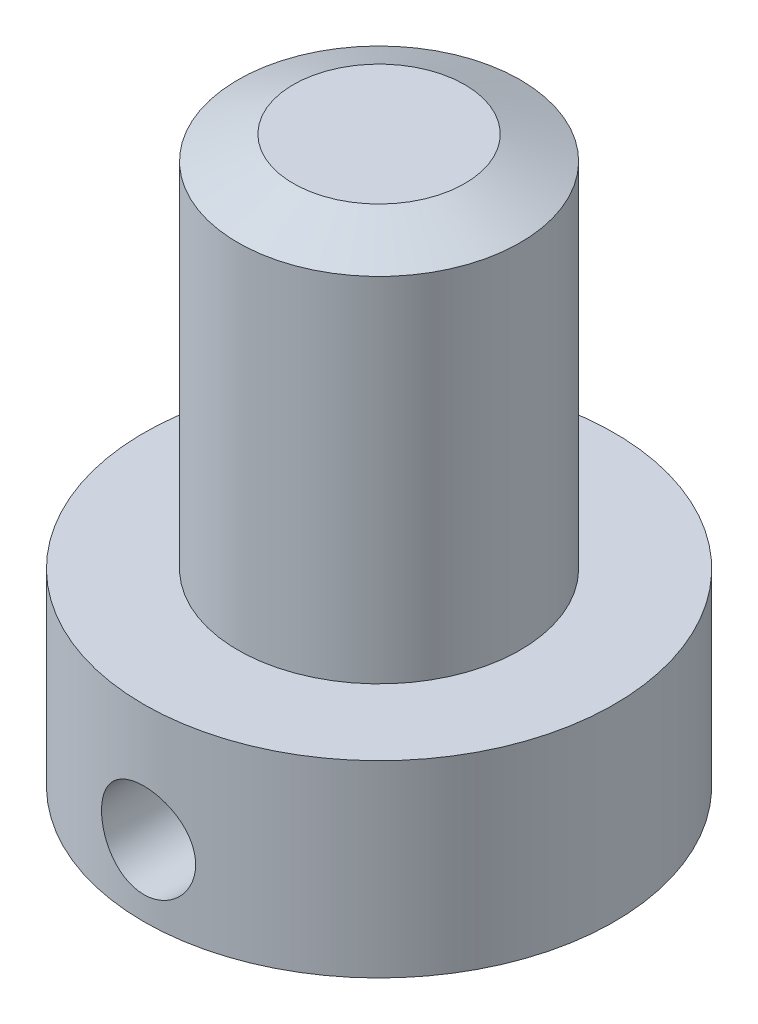
ISO-10303-21;
HEADER;
FILE_DESCRIPTION(('STEP AP214'),'2;1');
FILE_NAME('part.step','',(''),(''),'','','');
FILE_SCHEMA(('AUTOMOTIVE_DESIGN { 1 0 10303 214 1 1 1 1 }'));
ENDSEC;
DATA;
#1=APPLICATION_CONTEXT('core data for automotive mechanical design processes');
#2=APPLICATION_PROTOCOL_DEFINITION('international standard','automotive_design',2000,#1);
#3=PRODUCT_CONTEXT('',#1,'mechanical');
#4=PRODUCT('Part','Part','',(#3));
#5=PRODUCT_RELATED_PRODUCT_CATEGORY('part','',(#4));
#6=PRODUCT_DEFINITION_FORMATION('','',#4);
#7=PRODUCT_DEFINITION_CONTEXT('part definition',#1,'design');
#8=PRODUCT_DEFINITION('design','',#6,#7);
#9=PRODUCT_DEFINITION_SHAPE('','',#8);
#10=(LENGTH_UNIT() NAMED_UNIT(*) SI_UNIT(.MILLI.,.METRE.));
#11=(NAMED_UNIT(*) PLANE_ANGLE_UNIT() SI_UNIT($,.RADIAN.));
#12=(NAMED_UNIT(*) SI_UNIT($,.STERADIAN.) SOLID_ANGLE_UNIT());
#13=UNCERTAINTY_MEASURE_WITH_UNIT(LENGTH_MEASURE(1.E-05),#10,'distance_accuracy_value','');
#14=(GEOMETRIC_REPRESENTATION_CONTEXT(3) GLOBAL_UNCERTAINTY_ASSIGNED_CONTEXT((#13)) GLOBAL_UNIT_ASSIGNED_CONTEXT((#10,
#11,#12)) REPRESENTATION_CONTEXT('',''));
#15=CARTESIAN_POINT('',(0.,0.,0.));
#16=DIRECTION('',(0.,0.,1.));
#17=DIRECTION('',(1.,0.,0.));
#18=AXIS2_PLACEMENT_3D('',#15,#16,#17);
#19=CARTESIAN_POINT('',(0.,-5.,0.));
#20=DIRECTION('',(0.,-1.,0.));
#21=DIRECTION('',(0.,0.,-1.));
#22=AXIS2_PLACEMENT_3D('',#19,#20,#21);
#23=PLANE('',#22);
#24=CARTESIAN_POINT('',(0.,-4.99999999993861,0.));
#25=DIRECTION('',(0.,1.,0.));
#26=DIRECTION('',(0.,0.,1.));
#27=AXIS2_PLACEMENT_3D('',#24,#25,#26);
#28=CIRCLE('',#27,2.64414763421428);
#29=CARTESIAN_POINT('',(0.,-4.99999999993861,2.64414763421428));
#30=VERTEX_POINT('',#29);
#31=EDGE_CURVE('E18',#30,#30,#28,.T.);
#32=ORIENTED_EDGE('',*,*,#31,.F.);
#33=EDGE_LOOP('',(#32));
#34=FACE_BOUND('',#33,.T.);
#35=ADVANCED_FACE('F15',(#34),#23,.T.);
#36=CARTESIAN_POINT('',(0.,-3.99999999999068,0.));
#37=DIRECTION('',(0.,1.,0.));
#38=DIRECTION('',(0.,0.,1.));
#39=AXIS2_PLACEMENT_3D('',#36,#37,#38);
#40=CONICAL_SURFACE('',#39,4.99999999993861,1.16937059883975);
#41=ORIENTED_EDGE('',*,*,#31,.T.);
#42=EDGE_LOOP('',(#41));
#43=FACE_BOUND('',#42,.T.);
#44=CARTESIAN_POINT('',(0.,-4.,0.));
#45=DIRECTION('',(0.,1.,0.));
#46=DIRECTION('',(0.,0.,1.));
#47=AXIS2_PLACEMENT_3D('',#44,#45,#46);
#48=CIRCLE('',#47,5.);
#49=CARTESIAN_POINT('',(0.,-4.,5.));
#50=VERTEX_POINT('',#49);
#51=EDGE_CURVE('E31',#50,#50,#48,.T.);
#52=ORIENTED_EDGE('',*,*,#51,.F.);
#53=EDGE_LOOP('',(#52));
#54=FACE_BOUND('',#53,.T.);
#55=ADVANCED_FACE('F64',(#43,#54),#40,.T.);
#56=CARTESIAN_POINT('',(0.,-2.5,-5.));
#57=DIRECTION('',(0.,0.,1.));
#58=DIRECTION('',(1.,0.,0.));
#59=AXIS2_PLACEMENT_3D('',#56,#57,#58);
#60=CYLINDRICAL_SURFACE('',#59,1.);
#61=CARTESIAN_POINT('',(0.,-3.5,5.));
#62=CARTESIAN_POINT('',(-0.0555660899557541,-3.49999758833867,4.99999879921278));
#63=CARTESIAN_POINT('',(-0.111165860292172,-3.49535211977595,4.99906401975124));
#64=CARTESIAN_POINT('',(-0.220802499525631,-3.47690471390568,4.99542431257793));
#65=CARTESIAN_POINT('',(-0.274837715618948,-3.46309343747751,4.99271757944547));
#66=CARTESIAN_POINT('',(-0.379732039429442,-3.42675799601684,4.98583634570209));
#67=CARTESIAN_POINT('',(-0.430594361145944,-3.40424281972277,4.98166335973136));
#68=CARTESIAN_POINT('',(-0.527811709985339,-3.35116533868859,4.97230357823047));
#69=CARTESIAN_POINT('',(-0.574167356309711,-3.3206041415893,4.96711692227064));
#70=CARTESIAN_POINT('',(-0.661688712483616,-3.25186532414265,4.95622223968352));
#71=CARTESIAN_POINT('',(-0.702785065204754,-3.21360026809398,4.95050867816156));
#72=CARTESIAN_POINT('',(-0.778029451315118,-3.13071679561595,4.9392430057825));
#73=CARTESIAN_POINT('',(-0.812175448515783,-3.08609652383999,4.93369094264538));
#74=CARTESIAN_POINT('',(-0.872847544067748,-2.99126034012851,4.92332167047395));
#75=CARTESIAN_POINT('',(-0.899298039084476,-2.94099522045782,4.9185119571059));
#76=CARTESIAN_POINT('',(-0.943324794525737,-2.83665579767931,4.9102591314283));
#77=CARTESIAN_POINT('',(-0.96091117411527,-2.78258591879904,4.90681446176687));
#78=CARTESIAN_POINT('',(-0.982492106962822,-2.69019342934517,4.90252831695839));
#79=CARTESIAN_POINT('',(-0.989047250453888,-2.65247137159105,4.90120451071183));
#80=CARTESIAN_POINT('',(-0.997801984660447,-2.57650486501253,4.89942965863018));
#81=CARTESIAN_POINT('',(-1.00000166828393,-2.53826042734874,4.89897859417831));
#82=CARTESIAN_POINT('',(-0.999997577676552,-2.44444642873404,4.89898077984854));
#83=CARTESIAN_POINT('',(-0.995354131432741,-2.38885914704218,4.89993491490869));
#84=CARTESIAN_POINT('',(-0.976915489593405,-2.2792484727456,4.90364364451088));
#85=CARTESIAN_POINT('',(-0.963110911908651,-2.22522674270769,4.90640008478535));
#86=CARTESIAN_POINT('',(-0.926795053169297,-2.12036096499901,4.91338888688327));
#87=CARTESIAN_POINT('',(-0.904293073174589,-2.06951358989501,4.91761967155898));
#88=CARTESIAN_POINT('',(-0.851246697438147,-1.97232143808981,4.9270783997548));
#89=CARTESIAN_POINT('',(-0.820703378022719,-1.92597605993588,4.93230620979813));
#90=CARTESIAN_POINT('',(-0.751982893703484,-1.83844376275209,4.94325240741494));
#91=CARTESIAN_POINT('',(-0.713714278944508,-1.7973293017679,4.94897615217622));
#92=CARTESIAN_POINT('',(-0.630816004266841,-1.72204977523525,4.9602235287064));
#93=CARTESIAN_POINT('',(-0.586184537489432,-1.68788669038032,4.96574710307222));
#94=CARTESIAN_POINT('',(-0.491337927342742,-1.62719621588172,4.97603068021787));
#95=CARTESIAN_POINT('',(-0.44107550305954,-1.60074142646883,4.98078324712073));
#96=CARTESIAN_POINT('',(-0.336741881764226,-1.55670596135512,4.9889208679889));
#97=CARTESIAN_POINT('',(-0.282675081444655,-1.53911522742518,4.99230747106678));
#98=CARTESIAN_POINT('',(-0.190271085007254,-1.51752226955323,4.99651814387714));
#99=CARTESIAN_POINT('',(-0.15253343331506,-1.51096170573971,4.99781734299069));
#100=CARTESIAN_POINT('',(-0.0765358412171107,-1.50219978359349,4.99955867612138));
#101=CARTESIAN_POINT('',(-0.0382759111902653,-1.49999833876137,5.00000082714521));
#102=CARTESIAN_POINT('',(0.055566089955753,-1.50000241166133,4.99999879921278));
#103=CARTESIAN_POINT('',(0.111165860292171,-1.50464788022405,4.99906401975124));
#104=CARTESIAN_POINT('',(0.22080249952563,-1.52309528609432,4.99542431257793));
#105=CARTESIAN_POINT('',(0.274837715618947,-1.53690656252249,4.99271757944547));
#106=CARTESIAN_POINT('',(0.379732039429441,-1.57324200398316,4.98583634570209));
#107=CARTESIAN_POINT('',(0.430594361145943,-1.59575718027723,4.98166335973136));
#108=CARTESIAN_POINT('',(0.527811709985337,-1.64883466131141,4.97230357823047));
#109=CARTESIAN_POINT('',(0.57416735630971,-1.6793958584107,4.96711692227064));
#110=CARTESIAN_POINT('',(0.661688712483615,-1.74813467585735,4.95622223968352));
#111=CARTESIAN_POINT('',(0.702785065204753,-1.78639973190602,4.95050867816156));
#112=CARTESIAN_POINT('',(0.778029451315117,-1.86928320438405,4.9392430057825));
#113=CARTESIAN_POINT('',(0.812175448515782,-1.91390347616001,4.93369094264538));
#114=CARTESIAN_POINT('',(0.872847544067747,-2.00873965987149,4.92332167047395));
#115=CARTESIAN_POINT('',(0.899298039084475,-2.05900477954218,4.9185119571059));
#116=CARTESIAN_POINT('',(0.943324794525736,-2.16334420232068,4.9102591314283));
#117=CARTESIAN_POINT('',(0.960911174115269,-2.21741408120096,4.90681446176687));
#118=CARTESIAN_POINT('',(0.982492106962821,-2.30980657065483,4.90252831695839));
#119=CARTESIAN_POINT('',(0.989047250453888,-2.34752862840895,4.90120451071183));
#120=CARTESIAN_POINT('',(0.997801984660447,-2.42349513498747,4.89942965863018));
#121=CARTESIAN_POINT('',(1.00000166828393,-2.46173957265126,4.89897859417831));
#122=CARTESIAN_POINT('',(0.999997577676552,-2.55555357126597,4.89898077984854));
#123=CARTESIAN_POINT('',(0.995354131432741,-2.61114085295782,4.89993491490869));
#124=CARTESIAN_POINT('',(0.976915489593405,-2.72075152725441,4.90364364451088));
#125=CARTESIAN_POINT('',(0.963110911908651,-2.77477325729231,4.90640008478535));
#126=CARTESIAN_POINT('',(0.926795053169297,-2.87963903500099,4.91338888688327));
#127=CARTESIAN_POINT('',(0.904293073174589,-2.93048641010499,4.91761967155898));
#128=CARTESIAN_POINT('',(0.851246697438147,-3.02767856191019,4.9270783997548));
#129=CARTESIAN_POINT('',(0.820703378022719,-3.07402394006412,4.93230620979813));
#130=CARTESIAN_POINT('',(0.751982893703484,-3.16155623724791,4.94325240741494));
#131=CARTESIAN_POINT('',(0.713714278944508,-3.2026706982321,4.94897615217622));
#132=CARTESIAN_POINT('',(0.630816004266841,-3.27795022476475,4.9602235287064));
#133=CARTESIAN_POINT('',(0.586184537489432,-3.31211330961968,4.96574710307222));
#134=CARTESIAN_POINT('',(0.491337927342741,-3.37280378411828,4.97603068021787));
#135=CARTESIAN_POINT('',(0.44107550305954,-3.39925857353117,4.98078324712073));
#136=CARTESIAN_POINT('',(0.336741881764227,-3.44329403864488,4.9889208679889));
#137=CARTESIAN_POINT('',(0.282675081444655,-3.46088477257482,4.99230747106678));
#138=CARTESIAN_POINT('',(0.190271085007254,-3.48247773044677,4.99651814387714));
#139=CARTESIAN_POINT('',(0.15253343331506,-3.48903829426029,4.99781734299069));
#140=CARTESIAN_POINT('',(0.0765358412171101,-3.49780021640651,4.99955867612138));
#141=CARTESIAN_POINT('',(0.0382759111902644,-3.50000166123863,5.00000082714521));
#142=CARTESIAN_POINT('',(0.,-3.5,5.));
#143=B_SPLINE_CURVE_WITH_KNOTS('',3,(#61,#62,#63,#64,#65,#66,#67,#68,#69,#70,#71,#72,#73,#74,
#75,#76,#77,#78,#79,#80,#81,#82,#83,#84,#85,#86,#87,#88,#89,#90,#91,#92,#93,#94,#95,#96,#97,#98,
#99,#100,#101,#102,#103,#104,#105,#106,#107,#108,#109,#110,#111,#112,#113,#114,#115,#116,#117,
#118,#119,#120,#121,#122,#123,#124,#125,#126,#127,#128,#129,#130,#131,#132,#133,#134,#135,#136,
#137,#138,#139,#140,#141,#142),.UNSPECIFIED.,.T.,.F.,(4,2,2,2,2,2,2,2,2,2,2,2,2,2,2,2,2,2,2,2,2,
2,2,2,2,2,2,2,2,2,2,2,2,2,2,2,2,2,2,2,4),(0.,0.166557341649282,0.333284651099258,
0.499840235029466,0.666372902365899,0.834914596822325,1.00350559671287,1.17370091491384,
1.34370149766706,1.45838812199119,1.57307229986442,1.73959201984785,1.90628253956532,
2.07279529034781,2.23928576486402,2.40787674726783,2.57651570015802,2.74669511488504,
2.91668098615488,3.0314139200321,3.14614457720325,3.31270191885253,3.47942922830251,
3.64598481223271,3.81251747956914,3.98105917402557,4.14965017391612,4.31984549211708,
4.4898460748703,4.60453269919444,4.71921687706766,4.8857365970511,5.05242711676856,
5.21893986755105,5.38543034206726,5.55402132447108,5.72266027736126,5.89283969208829,
6.06282556335812,6.17755849723535,6.2922891544065),.UNSPECIFIED.);
#144=CARTESIAN_POINT('',(0.,-3.5,5.));
#145=VERTEX_POINT('',#144);
#146=EDGE_CURVE('E43',#145,#145,#143,.T.);
#147=ORIENTED_EDGE('',*,*,#146,.F.);
#148=EDGE_LOOP('',(#147));
#149=FACE_BOUND('',#148,.T.);
#150=CARTESIAN_POINT('',(1.,-2.5,-4.89897948556636));
#151=CARTESIAN_POINT('',(0.999997577676552,-2.44444642873404,-4.89898077984854));
#152=CARTESIAN_POINT('',(0.995354131432741,-2.38885914704218,-4.89993491490869));
#153=CARTESIAN_POINT('',(0.976915489593405,-2.27924847274559,-4.90364364451088));
#154=CARTESIAN_POINT('',(0.963110911908651,-2.22522674270769,-4.90640008478535));
#155=CARTESIAN_POINT('',(0.926795053169297,-2.12036096499901,-4.91338888688327));
#156=CARTESIAN_POINT('',(0.904293073174589,-2.06951358989501,-4.91761967155898));
#157=CARTESIAN_POINT('',(0.851246697438147,-1.97232143808981,-4.9270783997548));
#158=CARTESIAN_POINT('',(0.820703378022719,-1.92597605993588,-4.93230620979813));
#159=CARTESIAN_POINT('',(0.751982893703484,-1.83844376275209,-4.94325240741494));
#160=CARTESIAN_POINT('',(0.713714278944508,-1.7973293017679,-4.94897615217622));
#161=CARTESIAN_POINT('',(0.630816004266841,-1.72204977523525,-4.9602235287064));
#162=CARTESIAN_POINT('',(0.586184537489432,-1.68788669038032,-4.96574710307222));
#163=CARTESIAN_POINT('',(0.491337927342742,-1.62719621588172,-4.97603068021787));
#164=CARTESIAN_POINT('',(0.44107550305954,-1.60074142646883,-4.98078324712073));
#165=CARTESIAN_POINT('',(0.336741881764227,-1.55670596135512,-4.9889208679889));
#166=CARTESIAN_POINT('',(0.282675081444655,-1.53911522742518,-4.99230747106678));
#167=CARTESIAN_POINT('',(0.190271085007254,-1.51752226955323,-4.99651814387714));
#168=CARTESIAN_POINT('',(0.15253343331506,-1.51096170573971,-4.99781734299069));
#169=CARTESIAN_POINT('',(0.0765358412171108,-1.50219978359349,-4.99955867612138));
#170=CARTESIAN_POINT('',(0.0382759111902652,-1.49999833876137,-5.00000082714521));
#171=CARTESIAN_POINT('',(-0.0555660899557532,-1.50000241166133,-4.99999879921278));
#172=CARTESIAN_POINT('',(-0.111165860292171,-1.50464788022405,-4.99906401975124));
#173=CARTESIAN_POINT('',(-0.22080249952563,-1.52309528609432,-4.99542431257793));
#174=CARTESIAN_POINT('',(-0.274837715618947,-1.53690656252249,-4.99271757944547));
#175=CARTESIAN_POINT('',(-0.379732039429441,-1.57324200398316,-4.98583634570209));
#176=CARTESIAN_POINT('',(-0.430594361145943,-1.59575718027723,-4.98166335973136));
#177=CARTESIAN_POINT('',(-0.527811709985337,-1.64883466131141,-4.97230357823047));
#178=CARTESIAN_POINT('',(-0.57416735630971,-1.6793958584107,-4.96711692227064));
#179=CARTESIAN_POINT('',(-0.661688712483615,-1.74813467585735,-4.95622223968352));
#180=CARTESIAN_POINT('',(-0.702785065204753,-1.78639973190602,-4.95050867816156));
#181=CARTESIAN_POINT('',(-0.778029451315117,-1.86928320438405,-4.9392430057825));
#182=CARTESIAN_POINT('',(-0.812175448515782,-1.91390347616001,-4.93369094264538));
#183=CARTESIAN_POINT('',(-0.872847544067747,-2.00873965987149,-4.92332167047395));
#184=CARTESIAN_POINT('',(-0.899298039084475,-2.05900477954218,-4.9185119571059));
#185=CARTESIAN_POINT('',(-0.943324794525737,-2.16334420232068,-4.9102591314283));
#186=CARTESIAN_POINT('',(-0.96091117411527,-2.21741408120096,-4.90681446176687));
#187=CARTESIAN_POINT('',(-0.982492106962821,-2.30980657065483,-4.90252831695839));
#188=CARTESIAN_POINT('',(-0.989047250453888,-2.34752862840895,-4.90120451071183));
#189=CARTESIAN_POINT('',(-0.997801984660447,-2.42349513498747,-4.89942965863018));
#190=CARTESIAN_POINT('',(-1.00000166828393,-2.46173957265126,-4.89897859417831));
#191=CARTESIAN_POINT('',(-0.999997577676552,-2.55555357126597,-4.89898077984854));
#192=CARTESIAN_POINT('',(-0.995354131432741,-2.61114085295782,-4.89993491490869));
#193=CARTESIAN_POINT('',(-0.976915489593405,-2.72075152725441,-4.90364364451088));
#194=CARTESIAN_POINT('',(-0.963110911908651,-2.77477325729231,-4.90640008478535));
#195=CARTESIAN_POINT('',(-0.926795053169297,-2.87963903500099,-4.91338888688327));
#196=CARTESIAN_POINT('',(-0.904293073174589,-2.93048641010499,-4.91761967155898));
#197=CARTESIAN_POINT('',(-0.851246697438147,-3.02767856191019,-4.9270783997548));
#198=CARTESIAN_POINT('',(-0.820703378022719,-3.07402394006412,-4.93230620979813));
#199=CARTESIAN_POINT('',(-0.751982893703484,-3.16155623724791,-4.94325240741494));
#200=CARTESIAN_POINT('',(-0.713714278944509,-3.2026706982321,-4.94897615217622));
#201=CARTESIAN_POINT('',(-0.630816004266841,-3.27795022476475,-4.9602235287064));
#202=CARTESIAN_POINT('',(-0.586184537489432,-3.31211330961968,-4.96574710307222));
#203=CARTESIAN_POINT('',(-0.491337927342742,-3.37280378411828,-4.97603068021787));
#204=CARTESIAN_POINT('',(-0.44107550305954,-3.39925857353117,-4.98078324712073));
#205=CARTESIAN_POINT('',(-0.336741881764227,-3.44329403864488,-4.9889208679889));
#206=CARTESIAN_POINT('',(-0.282675081444655,-3.46088477257482,-4.99230747106678));
#207=CARTESIAN_POINT('',(-0.190271085007254,-3.48247773044677,-4.99651814387714));
#208=CARTESIAN_POINT('',(-0.15253343331506,-3.48903829426029,-4.99781734299069));
#209=CARTESIAN_POINT('',(-0.0765358412171103,-3.49780021640651,-4.99955867612138));
#210=CARTESIAN_POINT('',(-0.0382759111902646,-3.50000166123863,-5.00000082714521));
#211=CARTESIAN_POINT('',(0.0555660899557539,-3.49999758833867,-4.99999879921278));
#212=CARTESIAN_POINT('',(0.111165860292172,-3.49535211977595,-4.99906401975124));
#213=CARTESIAN_POINT('',(0.22080249952563,-3.47690471390568,-4.99542431257793));
#214=CARTESIAN_POINT('',(0.274837715618948,-3.46309343747751,-4.99271757944547));
#215=CARTESIAN_POINT('',(0.379732039429441,-3.42675799601684,-4.98583634570209));
#216=CARTESIAN_POINT('',(0.430594361145944,-3.40424281972277,-4.98166335973136));
#217=CARTESIAN_POINT('',(0.527811709985338,-3.35116533868859,-4.97230357823047));
#218=CARTESIAN_POINT('',(0.574167356309711,-3.3206041415893,-4.96711692227064));
#219=CARTESIAN_POINT('',(0.661688712483616,-3.25186532414265,-4.95622223968352));
#220=CARTESIAN_POINT('',(0.702785065204754,-3.21360026809398,-4.95050867816156));
#221=CARTESIAN_POINT('',(0.778029451315118,-3.13071679561595,-4.9392430057825));
#222=CARTESIAN_POINT('',(0.812175448515783,-3.08609652383999,-4.93369094264538));
#223=CARTESIAN_POINT('',(0.872847544067748,-2.99126034012851,-4.92332167047395));
#224=CARTESIAN_POINT('',(0.899298039084475,-2.94099522045782,-4.9185119571059));
#225=CARTESIAN_POINT('',(0.943324794525737,-2.83665579767932,-4.9102591314283));
#226=CARTESIAN_POINT('',(0.96091117411527,-2.78258591879904,-4.90681446176687));
#227=CARTESIAN_POINT('',(0.982492106962821,-2.69019342934517,-4.90252831695839));
#228=CARTESIAN_POINT('',(0.989047250453888,-2.65247137159105,-4.90120451071183));
#229=CARTESIAN_POINT('',(0.997801984660447,-2.57650486501253,-4.89942965863018));
#230=CARTESIAN_POINT('',(1.00000166828393,-2.53826042734874,-4.89897859417831));
#231=CARTESIAN_POINT('',(1.,-2.5,-4.89897948556636));
#232=B_SPLINE_CURVE_WITH_KNOTS('',3,(#150,#151,#152,#153,#154,#155,#156,#157,#158,#159,#160,
#161,#162,#163,#164,#165,#166,#167,#168,#169,#170,#171,#172,#173,#174,#175,#176,#177,#178,#179,
#180,#181,#182,#183,#184,#185,#186,#187,#188,#189,#190,#191,#192,#193,#194,#195,#196,#197,#198,
#199,#200,#201,#202,#203,#204,#205,#206,#207,#208,#209,#210,#211,#212,#213,#214,#215,#216,#217,
#218,#219,#220,#221,#222,#223,#224,#225,#226,#227,#228,#229,#230,#231),.UNSPECIFIED.,.T.,.F.,(4,
2,2,2,2,2,2,2,2,2,2,2,2,2,2,2,2,2,2,2,2,2,2,2,2,2,2,2,2,2,2,2,2,2,2,2,2,2,2,2,4),(0.,
0.166519719983431,0.3332102397009,0.49972299048339,0.6662134649996,0.834804447403417,
1.0034434002936,1.17362281502062,1.34360868629046,1.45834162016769,1.57307227733883,
1.73962961898811,1.90635692843809,2.0729125123683,2.23944517970473,2.40798687416115,
2.5765778740517,2.74677319225267,2.91677377500589,3.03146039933002,3.14614457720325,
3.31266429718668,3.47935481690415,3.64586756768664,3.81235804220285,3.98094902460666,
4.14958797749685,4.31976739222387,4.48975326349371,4.60448619737093,4.71921685454208,
4.88577419619136,5.05250150564134,5.21905708957155,5.38558975690798,5.5541314513644,
5.72272245125495,5.89291776945592,6.06291835220914,6.17760497653327,6.2922891544065),.UNSPECIFIED.);
#233=CARTESIAN_POINT('',(1.,-2.5,-4.89897948556636));
#234=VERTEX_POINT('',#233);
#235=EDGE_CURVE('E37',#234,#234,#232,.T.);
#236=ORIENTED_EDGE('',*,*,#235,.F.);
#237=EDGE_LOOP('',(#236));
#238=FACE_BOUND('',#237,.T.);
#239=ADVANCED_FACE('F46',(#149,#238),#60,.F.);
#240=CARTESIAN_POINT('',(0.,8.,0.));
#241=DIRECTION('',(0.,1.,0.));
#242=DIRECTION('',(0.,0.,1.));
#243=AXIS2_PLACEMENT_3D('',#240,#241,#242);
#244=PLANE('',#243);
#245=CARTESIAN_POINT('',(0.,8.00000000000978,0.));
#246=DIRECTION('',(0.,-1.,0.));
#247=DIRECTION('',(0.,0.,-1.));
#248=AXIS2_PLACEMENT_3D('',#245,#246,#247);
#249=CIRCLE('',#248,1.82207381709532);
#250=CARTESIAN_POINT('',(0.,8.00000000000978,-1.82207381709532));
#251=VERTEX_POINT('',#250);
#252=EDGE_CURVE('E34',#251,#251,#249,.T.);
#253=ORIENTED_EDGE('',*,*,#252,.F.);
#254=EDGE_LOOP('',(#253));
#255=FACE_BOUND('',#254,.T.);
#256=ADVANCED_FACE('F54',(#255),#244,.T.);
#257=CARTESIAN_POINT('',(0.,-5.,0.));
#258=DIRECTION('',(0.,1.,0.));
#259=DIRECTION('',(0.,0.,1.));
#260=AXIS2_PLACEMENT_3D('',#257,#258,#259);
#261=CYLINDRICAL_SURFACE('',#260,5.);
#262=ORIENTED_EDGE('',*,*,#51,.T.);
#263=EDGE_LOOP('',(#262));
#264=FACE_BOUND('',#263,.T.);
#265=ORIENTED_EDGE('',*,*,#146,.T.);
#266=EDGE_LOOP('',(#265));
#267=FACE_BOUND('',#266,.T.);
#268=CARTESIAN_POINT('',(0.,0.,0.));
#269=DIRECTION('',(0.,1.,0.));
#270=DIRECTION('',(0.,0.,1.));
#271=AXIS2_PLACEMENT_3D('',#268,#269,#270);
#272=CIRCLE('',#271,5.);
#273=CARTESIAN_POINT('',(0.,0.,5.));
#274=VERTEX_POINT('',#273);
#275=EDGE_CURVE('E27',#274,#274,#272,.F.);
#276=ORIENTED_EDGE('',*,*,#275,.T.);
#277=EDGE_LOOP('',(#276));
#278=FACE_BOUND('',#277,.T.);
#279=ORIENTED_EDGE('',*,*,#235,.T.);
#280=EDGE_LOOP('',(#279));
#281=FACE_BOUND('',#280,.T.);
#282=ADVANCED_FACE('F49',(#264,#267,#278,#281),#261,.T.);
#283=CARTESIAN_POINT('',(0.,7.49999999999318,0.));
#284=DIRECTION('',(0.,-1.,0.));
#285=DIRECTION('',(0.,0.,-1.));
#286=AXIS2_PLACEMENT_3D('',#283,#284,#285);
#287=CONICAL_SURFACE('',#286,2.9999999999859,1.16937059881776);
#288=CARTESIAN_POINT('',(0.,7.5,0.));
#289=DIRECTION('',(0.,-1.,0.));
#290=DIRECTION('',(0.,0.,-1.));
#291=AXIS2_PLACEMENT_3D('',#288,#289,#290);
#292=CIRCLE('',#291,3.);
#293=CARTESIAN_POINT('',(0.,7.5,-3.));
#294=VERTEX_POINT('',#293);
#295=EDGE_CURVE('E22',#294,#294,#292,.T.);
#296=ORIENTED_EDGE('',*,*,#295,.F.);
#297=EDGE_LOOP('',(#296));
#298=FACE_BOUND('',#297,.T.);
#299=ORIENTED_EDGE('',*,*,#252,.T.);
#300=EDGE_LOOP('',(#299));
#301=FACE_BOUND('',#300,.T.);
#302=ADVANCED_FACE('F53',(#298,#301),#287,.T.);
#303=CARTESIAN_POINT('',(0.,0.,0.));
#304=DIRECTION('',(0.,-1.,0.));
#305=DIRECTION('',(0.,0.,-1.));
#306=AXIS2_PLACEMENT_3D('',#303,#304,#305);
#307=PLANE('',#306);
#308=ORIENTED_EDGE('',*,*,#275,.F.);
#309=EDGE_LOOP('',(#308));
#310=FACE_BOUND('',#309,.T.);
#311=CARTESIAN_POINT('',(0.,0.,0.));
#312=DIRECTION('',(0.,-1.,0.));
#313=DIRECTION('',(0.,0.,-1.));
#314=AXIS2_PLACEMENT_3D('',#311,#312,#313);
#315=CIRCLE('',#314,3.);
#316=CARTESIAN_POINT('',(0.,0.,-3.));
#317=VERTEX_POINT('',#316);
#318=EDGE_CURVE('E10',#317,#317,#315,.F.);
#319=ORIENTED_EDGE('',*,*,#318,.F.);
#320=EDGE_LOOP('',(#319));
#321=FACE_BOUND('',#320,.T.);
#322=ADVANCED_FACE('F69',(#310,#321),#307,.F.);
#323=CARTESIAN_POINT('',(0.,8.,0.));
#324=DIRECTION('',(0.,-1.,0.));
#325=DIRECTION('',(0.,0.,-1.));
#326=AXIS2_PLACEMENT_3D('',#323,#324,#325);
#327=CYLINDRICAL_SURFACE('',#326,3.);
#328=ORIENTED_EDGE('',*,*,#318,.T.);
#329=EDGE_LOOP('',(#328));
#330=FACE_BOUND('',#329,.T.);
#331=ORIENTED_EDGE('',*,*,#295,.T.);
#332=EDGE_LOOP('',(#331));
#333=FACE_BOUND('',#332,.T.);
#334=ADVANCED_FACE('F67',(#330,#333),#327,.T.);
#335=CLOSED_SHELL('',(#35,#55,#239,#256,#282,#302,#322,#334));
#336=MANIFOLD_SOLID_BREP('B1',#335);
#337=ADVANCED_BREP_SHAPE_REPRESENTATION('',(#18,#336),#14);
#338=SHAPE_DEFINITION_REPRESENTATION(#9,#337);
ENDSEC;
END-ISO-10303-21;
